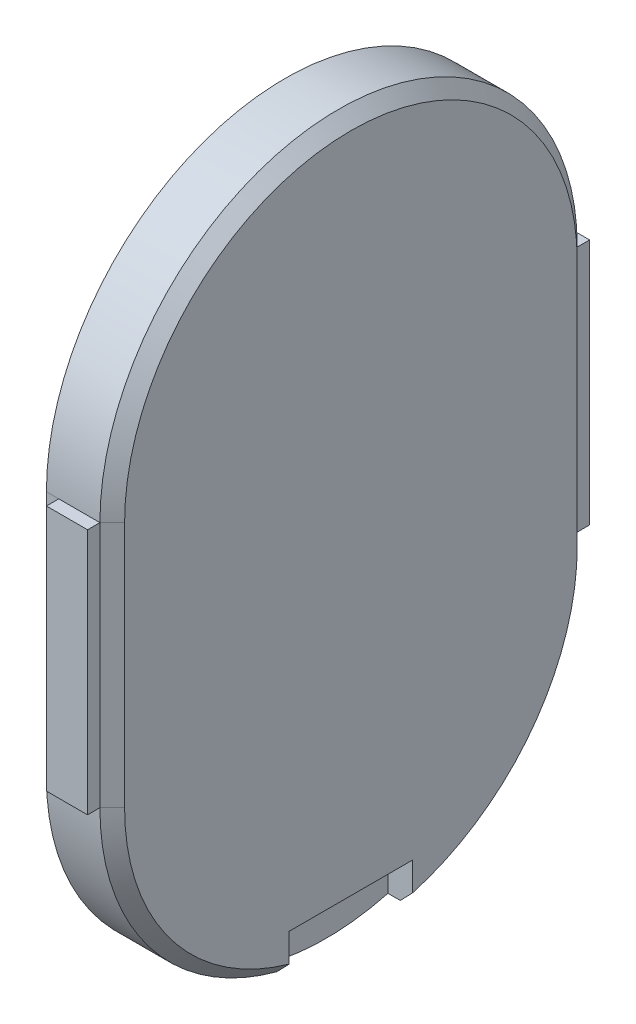
ISO-10303-21;
HEADER;
FILE_DESCRIPTION(('STEP AP214'),'2;1');
FILE_NAME('part.step','',(''),(''),'','','');
FILE_SCHEMA(('AUTOMOTIVE_DESIGN { 1 0 10303 214 1 1 1 1 }'));
ENDSEC;
DATA;
#1=APPLICATION_CONTEXT('core data for automotive mechanical design processes');
#2=APPLICATION_PROTOCOL_DEFINITION('international standard','automotive_design',2000,#1);
#3=PRODUCT_CONTEXT('',#1,'mechanical');
#4=PRODUCT('Part','Part','',(#3));
#5=PRODUCT_RELATED_PRODUCT_CATEGORY('part','',(#4));
#6=PRODUCT_DEFINITION_FORMATION('','',#4);
#7=PRODUCT_DEFINITION_CONTEXT('part definition',#1,'design');
#8=PRODUCT_DEFINITION('design','',#6,#7);
#9=PRODUCT_DEFINITION_SHAPE('','',#8);
#10=(LENGTH_UNIT() NAMED_UNIT(*) SI_UNIT(.MILLI.,.METRE.));
#11=(NAMED_UNIT(*) PLANE_ANGLE_UNIT() SI_UNIT($,.RADIAN.));
#12=(NAMED_UNIT(*) SI_UNIT($,.STERADIAN.) SOLID_ANGLE_UNIT());
#13=UNCERTAINTY_MEASURE_WITH_UNIT(LENGTH_MEASURE(1.E-05),#10,'distance_accuracy_value','');
#14=(GEOMETRIC_REPRESENTATION_CONTEXT(3) GLOBAL_UNCERTAINTY_ASSIGNED_CONTEXT((#13)) GLOBAL_UNIT_ASSIGNED_CONTEXT((#10,
#11,#12)) REPRESENTATION_CONTEXT('',''));
#15=CARTESIAN_POINT('',(0.,0.,0.));
#16=DIRECTION('',(0.,0.,1.));
#17=DIRECTION('',(1.,0.,0.));
#18=AXIS2_PLACEMENT_3D('',#15,#16,#17);
#19=CARTESIAN_POINT('',(63.,110.,67.4));
#20=DIRECTION('',(-1.,0.,0.));
#21=DIRECTION('',(0.,0.,1.));
#22=AXIS2_PLACEMENT_3D('',#19,#20,#21);
#23=CYLINDRICAL_SURFACE('',#22,5.8);
#24=DIRECTION('',(-1.,0.,0.));
#25=VECTOR('',#24,1.);
#26=CARTESIAN_POINT('',(63.,104.397322068867,68.9));
#27=LINE('',#26,#25);
#28=CARTESIAN_POINT('',(62.7,104.397322068867,68.9));
#29=VERTEX_POINT('',#28);
#30=CARTESIAN_POINT('',(62.4,104.397322068867,68.9));
#31=VERTEX_POINT('',#30);
#32=EDGE_CURVE('E193',#29,#31,#27,.T.);
#33=ORIENTED_EDGE('',*,*,#32,.F.);
#34=CARTESIAN_POINT('',(62.7,110.,67.4));
#35=DIRECTION('',(-1.,0.,0.));
#36=DIRECTION('',(0.,0.,1.));
#37=AXIS2_PLACEMENT_3D('',#34,#35,#36);
#38=CIRCLE('',#37,5.8);
#39=CARTESIAN_POINT('',(62.7,110.,73.2));
#40=VERTEX_POINT('',#39);
#41=EDGE_CURVE('E327',#29,#40,#38,.T.);
#42=ORIENTED_EDGE('',*,*,#41,.T.);
#43=DIRECTION('',(-1.,0.,0.));
#44=VECTOR('',#43,1.);
#45=CARTESIAN_POINT('',(63.,110.,73.2));
#46=LINE('',#45,#44);
#47=CARTESIAN_POINT('',(61.7,110.,73.2));
#48=VERTEX_POINT('',#47);
#49=EDGE_CURVE('E294',#40,#48,#46,.T.);
#50=ORIENTED_EDGE('',*,*,#49,.T.);
#51=CARTESIAN_POINT('',(61.4,110.,73.2));
#52=VERTEX_POINT('',#51);
#53=EDGE_CURVE('E293',#48,#52,#46,.T.);
#54=ORIENTED_EDGE('',*,*,#53,.T.);
#55=CARTESIAN_POINT('',(61.4,110.,67.4));
#56=DIRECTION('',(1.,0.,0.));
#57=DIRECTION('',(0.,0.,1.));
#58=AXIS2_PLACEMENT_3D('',#55,#56,#57);
#59=CIRCLE('',#58,5.8);
#60=CARTESIAN_POINT('',(61.4,110.,61.6));
#61=VERTEX_POINT('',#60);
#62=EDGE_CURVE('E289',#52,#61,#59,.T.);
#63=ORIENTED_EDGE('',*,*,#62,.T.);
#64=DIRECTION('',(-1.,0.,0.));
#65=VECTOR('',#64,1.);
#66=CARTESIAN_POINT('',(63.,110.,61.6));
#67=LINE('',#66,#65);
#68=CARTESIAN_POINT('',(61.7,110.,61.6));
#69=VERTEX_POINT('',#68);
#70=EDGE_CURVE('E308',#69,#61,#67,.T.);
#71=ORIENTED_EDGE('',*,*,#70,.F.);
#72=CARTESIAN_POINT('',(62.7,110.,61.6));
#73=VERTEX_POINT('',#72);
#74=EDGE_CURVE('E309',#73,#69,#67,.T.);
#75=ORIENTED_EDGE('',*,*,#74,.F.);
#76=CARTESIAN_POINT('',(62.7,104.397322068867,65.9));
#77=VERTEX_POINT('',#76);
#78=EDGE_CURVE('E328',#73,#77,#38,.T.);
#79=ORIENTED_EDGE('',*,*,#78,.T.);
#80=DIRECTION('',(-1.,0.,0.));
#81=VECTOR('',#80,1.);
#82=CARTESIAN_POINT('',(63.,104.397322068867,65.9));
#83=LINE('',#82,#81);
#84=CARTESIAN_POINT('',(62.4,104.397322068867,65.9));
#85=VERTEX_POINT('',#84);
#86=EDGE_CURVE('E66',#77,#85,#83,.T.);
#87=ORIENTED_EDGE('',*,*,#86,.T.);
#88=CARTESIAN_POINT('',(62.4,110.,67.4));
#89=DIRECTION('',(1.,0.,0.));
#90=DIRECTION('',(0.,0.,-1.));
#91=AXIS2_PLACEMENT_3D('',#88,#89,#90);
#92=CIRCLE('',#91,5.8);
#93=EDGE_CURVE('E11',#31,#85,#92,.T.);
#94=ORIENTED_EDGE('',*,*,#93,.F.);
#95=EDGE_LOOP('',(#33,#42,#50,#54,#63,#71,#75,#79,#87,#94));
#96=FACE_BOUND('',#95,.T.);
#97=ADVANCED_FACE('F49',(#96),#23,.T.);
#98=CARTESIAN_POINT('',(63.,110.,67.4));
#99=DIRECTION('',(-1.,0.,0.));
#100=DIRECTION('',(0.,0.,1.));
#101=AXIS2_PLACEMENT_3D('',#98,#99,#100);
#102=PLANE('',#101);
#103=DIRECTION('',(0.,-1.,0.));
#104=VECTOR('',#103,1.);
#105=CARTESIAN_POINT('',(63.,110.,68.9));
#106=LINE('',#105,#104);
#107=CARTESIAN_POINT('',(63.,105.4,68.9));
#108=VERTEX_POINT('',#107);
#109=CARTESIAN_POINT('',(63.,104.708497377871,68.9));
#110=VERTEX_POINT('',#109);
#111=EDGE_CURVE('E207',#108,#110,#106,.T.);
#112=ORIENTED_EDGE('',*,*,#111,.F.);
#113=DIRECTION('',(0.,0.,1.));
#114=VECTOR('',#113,1.);
#115=CARTESIAN_POINT('',(63.,105.4,67.4));
#116=LINE('',#115,#114);
#117=CARTESIAN_POINT('',(63.,105.4,65.9));
#118=VERTEX_POINT('',#117);
#119=EDGE_CURVE('E59',#118,#108,#116,.T.);
#120=ORIENTED_EDGE('',*,*,#119,.F.);
#121=DIRECTION('',(0.,-1.,0.));
#122=VECTOR('',#121,1.);
#123=CARTESIAN_POINT('',(63.,110.,65.9));
#124=LINE('',#123,#122);
#125=CARTESIAN_POINT('',(63.,104.708497377871,65.9));
#126=VERTEX_POINT('',#125);
#127=EDGE_CURVE('E189',#118,#126,#124,.T.);
#128=ORIENTED_EDGE('',*,*,#127,.T.);
#129=CARTESIAN_POINT('',(63.,110.,67.4));
#130=DIRECTION('',(-1.,0.,0.));
#131=DIRECTION('',(0.,0.,1.));
#132=AXIS2_PLACEMENT_3D('',#129,#130,#131);
#133=CIRCLE('',#132,5.50000000000002);
#134=CARTESIAN_POINT('',(63.,110.,61.9));
#135=VERTEX_POINT('',#134);
#136=EDGE_CURVE('E322',#126,#135,#133,.F.);
#137=ORIENTED_EDGE('',*,*,#136,.T.);
#138=DIRECTION('',(0.,1.,0.));
#139=VECTOR('',#138,1.);
#140=CARTESIAN_POINT('',(63.,110.,61.9));
#141=LINE('',#140,#139);
#142=CARTESIAN_POINT('',(63.,116.,61.9));
#143=VERTEX_POINT('',#142);
#144=EDGE_CURVE('E319',#135,#143,#141,.T.);
#145=ORIENTED_EDGE('',*,*,#144,.T.);
#146=CARTESIAN_POINT('',(63.,116.,67.4));
#147=DIRECTION('',(-1.,0.,0.));
#148=DIRECTION('',(0.,0.,1.));
#149=AXIS2_PLACEMENT_3D('',#146,#147,#148);
#150=CIRCLE('',#149,5.50000000000002);
#151=CARTESIAN_POINT('',(63.,116.,72.9));
#152=VERTEX_POINT('',#151);
#153=EDGE_CURVE('E313',#143,#152,#150,.F.);
#154=ORIENTED_EDGE('',*,*,#153,.T.);
#155=DIRECTION('',(0.,-1.,0.));
#156=VECTOR('',#155,1.);
#157=CARTESIAN_POINT('',(63.,110.,72.9));
#158=LINE('',#157,#156);
#159=CARTESIAN_POINT('',(63.,110.,72.9));
#160=VERTEX_POINT('',#159);
#161=EDGE_CURVE('E316',#152,#160,#158,.T.);
#162=ORIENTED_EDGE('',*,*,#161,.T.);
#163=EDGE_CURVE('E323',#160,#110,#133,.F.);
#164=ORIENTED_EDGE('',*,*,#163,.T.);
#165=EDGE_LOOP('',(#112,#120,#128,#137,#145,#154,#162,#164));
#166=FACE_BOUND('',#165,.T.);
#167=ADVANCED_FACE('F425',(#166),#102,.F.);
#168=CARTESIAN_POINT('',(63.,110.,67.4));
#169=DIRECTION('',(-1.,0.,0.));
#170=DIRECTION('',(0.,0.,1.));
#171=AXIS2_PLACEMENT_3D('',#168,#169,#170);
#172=CONICAL_SURFACE('',#171,5.50000000000002,0.785398163397448);
#173=ORIENTED_EDGE('',*,*,#41,.F.);
#174=CARTESIAN_POINT('',(61.4628683123147,103.124592929155,68.9));
#175=CARTESIAN_POINT('',(61.6959494424737,103.363197804304,68.9));
#176=CARTESIAN_POINT('',(61.9287883147822,103.602040927902,68.9));
#177=CARTESIAN_POINT('',(62.3936696597395,104.080488885385,68.9));
#178=CARTESIAN_POINT('',(62.6257121524155,104.320093699818,68.9));
#179=CARTESIAN_POINT('',(63.0887046335069,104.800366398064,68.9));
#180=CARTESIAN_POINT('',(63.3196546032696,105.041034299892,68.9));
#181=CARTESIAN_POINT('',(63.6648267390506,105.403236485253,68.9));
#182=CARTESIAN_POINT('',(63.7796767548245,105.524172135007,68.9));
#183=CARTESIAN_POINT('',(64.0088383775944,105.766553873108,68.9));
#184=CARTESIAN_POINT('',(64.1231499809188,105.887999964926,68.9));
#185=CARTESIAN_POINT('',(64.2371316876853,106.00975611671,68.9));
#186=B_SPLINE_CURVE_WITH_KNOTS('',3,(#174,#175,#176,#177,#178,#179,#180,#181,#182,#183,#184,
#185),.UNSPECIFIED.,.F.,.F.,(4,2,2,2,2,4),(0.,1.00066718336188,2.00130901489091,
3.00196786925571,3.50230991491599,4.00265536751886),.UNSPECIFIED.);
#187=EDGE_CURVE('E365',#29,#110,#186,.T.);
#188=ORIENTED_EDGE('',*,*,#187,.T.);
#189=ORIENTED_EDGE('',*,*,#163,.F.);
#190=DIRECTION('',(-0.707106781186548,0.,0.707106781186548));
#191=VECTOR('',#190,1.);
#192=CARTESIAN_POINT('',(63.,110.,72.9));
#193=LINE('',#192,#191);
#194=EDGE_CURVE('E347',#160,#40,#193,.T.);
#195=ORIENTED_EDGE('',*,*,#194,.T.);
#196=EDGE_LOOP('',(#173,#188,#189,#195));
#197=FACE_BOUND('',#196,.T.);
#198=ADVANCED_FACE('F428',(#197),#172,.T.);
#199=CARTESIAN_POINT('',(63.,110.,73.2));
#200=DIRECTION('',(0.,0.,-1.));
#201=DIRECTION('',(-1.,0.,0.));
#202=AXIS2_PLACEMENT_3D('',#199,#200,#201);
#203=PLANE('',#202);
#204=DIRECTION('',(0.,-1.,0.));
#205=VECTOR('',#204,1.);
#206=CARTESIAN_POINT('',(61.7,110.,73.2));
#207=LINE('',#206,#205);
#208=CARTESIAN_POINT('',(61.7,116.,73.2));
#209=VERTEX_POINT('',#208);
#210=EDGE_CURVE('E74',#209,#48,#207,.T.);
#211=ORIENTED_EDGE('',*,*,#210,.F.);
#212=DIRECTION('',(-1.,0.,0.));
#213=VECTOR('',#212,1.);
#214=CARTESIAN_POINT('',(63.,116.,73.2));
#215=LINE('',#214,#213);
#216=CARTESIAN_POINT('',(61.4,116.,73.2));
#217=VERTEX_POINT('',#216);
#218=EDGE_CURVE('E298',#209,#217,#215,.T.);
#219=ORIENTED_EDGE('',*,*,#218,.T.);
#220=DIRECTION('',(0.,-1.,0.));
#221=VECTOR('',#220,1.);
#222=CARTESIAN_POINT('',(61.4,110.,73.2));
#223=LINE('',#222,#221);
#224=EDGE_CURVE('E285',#217,#52,#223,.T.);
#225=ORIENTED_EDGE('',*,*,#224,.T.);
#226=ORIENTED_EDGE('',*,*,#53,.F.);
#227=EDGE_LOOP('',(#211,#219,#225,#226));
#228=FACE_BOUND('',#227,.T.);
#229=ADVANCED_FACE('F438',(#228),#203,.F.);
#230=CARTESIAN_POINT('',(63.,116.,61.6));
#231=DIRECTION('',(0.,0.,1.));
#232=DIRECTION('',(1.,0.,0.));
#233=AXIS2_PLACEMENT_3D('',#230,#231,#232);
#234=PLANE('',#233);
#235=DIRECTION('',(0.,1.,0.));
#236=VECTOR('',#235,1.);
#237=CARTESIAN_POINT('',(61.7,116.,61.6));
#238=LINE('',#237,#236);
#239=CARTESIAN_POINT('',(61.7,116.,61.6));
#240=VERTEX_POINT('',#239);
#241=EDGE_CURVE('E271',#69,#240,#238,.T.);
#242=ORIENTED_EDGE('',*,*,#241,.F.);
#243=ORIENTED_EDGE('',*,*,#70,.T.);
#244=DIRECTION('',(0.,1.,0.));
#245=VECTOR('',#244,1.);
#246=CARTESIAN_POINT('',(61.4,116.,61.6));
#247=LINE('',#246,#245);
#248=CARTESIAN_POINT('',(61.4,116.,61.6));
#249=VERTEX_POINT('',#248);
#250=EDGE_CURVE('E276',#61,#249,#247,.T.);
#251=ORIENTED_EDGE('',*,*,#250,.T.);
#252=DIRECTION('',(-1.,0.,0.));
#253=VECTOR('',#252,1.);
#254=CARTESIAN_POINT('',(63.,116.,61.6));
#255=LINE('',#254,#253);
#256=EDGE_CURVE('E303',#240,#249,#255,.T.);
#257=ORIENTED_EDGE('',*,*,#256,.F.);
#258=EDGE_LOOP('',(#242,#243,#251,#257));
#259=FACE_BOUND('',#258,.T.);
#260=ADVANCED_FACE('F441',(#259),#234,.F.);
#261=CARTESIAN_POINT('',(63.,116.,67.4));
#262=DIRECTION('',(-1.,0.,0.));
#263=DIRECTION('',(0.,0.,1.));
#264=AXIS2_PLACEMENT_3D('',#261,#262,#263);
#265=CYLINDRICAL_SURFACE('',#264,5.8);
#266=CARTESIAN_POINT('',(62.7,116.,73.2));
#267=VERTEX_POINT('',#266);
#268=EDGE_CURVE('E299',#267,#209,#215,.T.);
#269=ORIENTED_EDGE('',*,*,#268,.F.);
#270=CARTESIAN_POINT('',(62.7,116.,67.4));
#271=DIRECTION('',(-1.,0.,0.));
#272=DIRECTION('',(0.,0.,1.));
#273=AXIS2_PLACEMENT_3D('',#270,#271,#272);
#274=CIRCLE('',#273,5.8);
#275=CARTESIAN_POINT('',(62.7,116.,61.6));
#276=VERTEX_POINT('',#275);
#277=EDGE_CURVE('E340',#267,#276,#274,.T.);
#278=ORIENTED_EDGE('',*,*,#277,.T.);
#279=EDGE_CURVE('E304',#276,#240,#255,.T.);
#280=ORIENTED_EDGE('',*,*,#279,.T.);
#281=ORIENTED_EDGE('',*,*,#256,.T.);
#282=CARTESIAN_POINT('',(61.4,116.,67.4));
#283=DIRECTION('',(1.,0.,0.));
#284=DIRECTION('',(0.,0.,1.));
#285=AXIS2_PLACEMENT_3D('',#282,#283,#284);
#286=CIRCLE('',#285,5.8);
#287=EDGE_CURVE('E280',#249,#217,#286,.T.);
#288=ORIENTED_EDGE('',*,*,#287,.T.);
#289=ORIENTED_EDGE('',*,*,#218,.F.);
#290=EDGE_LOOP('',(#269,#278,#280,#281,#288,#289));
#291=FACE_BOUND('',#290,.T.);
#292=ADVANCED_FACE('F433',(#291),#265,.T.);
#293=CARTESIAN_POINT('',(61.4,110.,67.4));
#294=DIRECTION('',(-1.,0.,0.));
#295=DIRECTION('',(0.,0.,1.));
#296=AXIS2_PLACEMENT_3D('',#293,#294,#295);
#297=PLANE('',#296);
#298=ORIENTED_EDGE('',*,*,#250,.F.);
#299=ORIENTED_EDGE('',*,*,#62,.F.);
#300=ORIENTED_EDGE('',*,*,#224,.F.);
#301=ORIENTED_EDGE('',*,*,#287,.F.);
#302=EDGE_LOOP('',(#298,#299,#300,#301));
#303=FACE_BOUND('',#302,.T.);
#304=ADVANCED_FACE('F430',(#303),#297,.T.);
#305=CARTESIAN_POINT('',(63.,116.,67.4));
#306=DIRECTION('',(-1.,0.,0.));
#307=DIRECTION('',(0.,0.,1.));
#308=AXIS2_PLACEMENT_3D('',#305,#306,#307);
#309=CONICAL_SURFACE('',#308,5.50000000000002,0.785398163397448);
#310=DIRECTION('',(0.707106781186548,0.,0.707106781186548));
#311=VECTOR('',#310,1.);
#312=CARTESIAN_POINT('',(62.7,116.,61.6));
#313=LINE('',#312,#311);
#314=EDGE_CURVE('E351',#276,#143,#313,.T.);
#315=ORIENTED_EDGE('',*,*,#314,.F.);
#316=ORIENTED_EDGE('',*,*,#277,.F.);
#317=DIRECTION('',(-0.707106781186548,0.,0.707106781186548));
#318=VECTOR('',#317,1.);
#319=CARTESIAN_POINT('',(63.,116.,72.9));
#320=LINE('',#319,#318);
#321=EDGE_CURVE('E281',#152,#267,#320,.T.);
#322=ORIENTED_EDGE('',*,*,#321,.F.);
#323=ORIENTED_EDGE('',*,*,#153,.F.);
#324=EDGE_LOOP('',(#315,#316,#322,#323));
#325=FACE_BOUND('',#324,.T.);
#326=ADVANCED_FACE('F52',(#325),#309,.T.);
#327=CARTESIAN_POINT('',(63.,110.,72.9));
#328=DIRECTION('',(-0.707106781186548,0.,-0.707106781186548));
#329=DIRECTION('',(0.,-1.,0.));
#330=AXIS2_PLACEMENT_3D('',#327,#328,#329);
#331=PLANE('',#330);
#332=ORIENTED_EDGE('',*,*,#321,.T.);
#333=DIRECTION('',(0.,1.,0.));
#334=VECTOR('',#333,1.);
#335=CARTESIAN_POINT('',(62.7,110.,73.2));
#336=LINE('',#335,#334);
#337=EDGE_CURVE('E336',#40,#267,#336,.T.);
#338=ORIENTED_EDGE('',*,*,#337,.F.);
#339=ORIENTED_EDGE('',*,*,#194,.F.);
#340=ORIENTED_EDGE('',*,*,#161,.F.);
#341=EDGE_LOOP('',(#332,#338,#339,#340));
#342=FACE_BOUND('',#341,.T.);
#343=ADVANCED_FACE('F502',(#342),#331,.F.);
#344=CARTESIAN_POINT('',(63.,110.,61.9));
#345=DIRECTION('',(-0.707106781186548,0.,0.707106781186548));
#346=DIRECTION('',(0.,1.,0.));
#347=AXIS2_PLACEMENT_3D('',#344,#345,#346);
#348=PLANE('',#347);
#349=ORIENTED_EDGE('',*,*,#314,.T.);
#350=ORIENTED_EDGE('',*,*,#144,.F.);
#351=DIRECTION('',(0.707106781186548,0.,0.707106781186548));
#352=VECTOR('',#351,1.);
#353=CARTESIAN_POINT('',(62.7,110.,61.6));
#354=LINE('',#353,#352);
#355=EDGE_CURVE('E275',#73,#135,#354,.T.);
#356=ORIENTED_EDGE('',*,*,#355,.F.);
#357=DIRECTION('',(0.,-1.,0.));
#358=VECTOR('',#357,1.);
#359=CARTESIAN_POINT('',(62.7,116.,61.6));
#360=LINE('',#359,#358);
#361=EDGE_CURVE('E332',#276,#73,#360,.T.);
#362=ORIENTED_EDGE('',*,*,#361,.F.);
#363=EDGE_LOOP('',(#349,#350,#356,#362));
#364=FACE_BOUND('',#363,.T.);
#365=ADVANCED_FACE('F466',(#364),#348,.F.);
#366=CARTESIAN_POINT('',(61.4628683123147,103.124592929155,65.9));
#367=CARTESIAN_POINT('',(61.6959494424737,103.363197804304,65.9));
#368=CARTESIAN_POINT('',(61.9287883147822,103.602040927902,65.9));
#369=CARTESIAN_POINT('',(62.3936696597395,104.080488885385,65.9));
#370=CARTESIAN_POINT('',(62.6257121524155,104.320093699818,65.9));
#371=CARTESIAN_POINT('',(63.0887046335069,104.800366398064,65.9));
#372=CARTESIAN_POINT('',(63.3196546032696,105.041034299892,65.9));
#373=CARTESIAN_POINT('',(63.6648267390506,105.403236485253,65.9));
#374=CARTESIAN_POINT('',(63.7796767548245,105.524172135007,65.9));
#375=CARTESIAN_POINT('',(64.0088383775944,105.766553873108,65.9));
#376=CARTESIAN_POINT('',(64.1231499809188,105.887999964926,65.9));
#377=CARTESIAN_POINT('',(64.2371316876853,106.00975611671,65.9));
#378=B_SPLINE_CURVE_WITH_KNOTS('',3,(#366,#367,#368,#369,#370,#371,#372,#373,#374,#375,#376,
#377),.UNSPECIFIED.,.F.,.F.,(4,2,2,2,2,4),(0.,1.00066718336188,2.00130901489091,
3.00196786925571,3.50230991491599,4.00265536751886),.UNSPECIFIED.);
#379=EDGE_CURVE('E343',#77,#126,#378,.T.);
#380=ORIENTED_EDGE('',*,*,#379,.F.);
#381=ORIENTED_EDGE('',*,*,#78,.F.);
#382=ORIENTED_EDGE('',*,*,#355,.T.);
#383=ORIENTED_EDGE('',*,*,#136,.F.);
#384=EDGE_LOOP('',(#380,#381,#382,#383));
#385=FACE_BOUND('',#384,.T.);
#386=ADVANCED_FACE('F372',(#385),#172,.T.);
#387=CARTESIAN_POINT('',(61.7,116.,61.61));
#388=DIRECTION('',(0.,-1.,0.));
#389=DIRECTION('',(0.,0.,-1.));
#390=AXIS2_PLACEMENT_3D('',#387,#388,#389);
#391=PLANE('',#390);
#392=DIRECTION('',(0.,0.,-1.));
#393=VECTOR('',#392,1.);
#394=CARTESIAN_POINT('',(61.7,116.,61.61));
#395=LINE('',#394,#393);
#396=CARTESIAN_POINT('',(61.7,116.,61.3));
#397=VERTEX_POINT('',#396);
#398=EDGE_CURVE('E259',#240,#397,#395,.T.);
#399=ORIENTED_EDGE('',*,*,#398,.F.);
#400=ORIENTED_EDGE('',*,*,#279,.F.);
#401=DIRECTION('',(0.,0.,-1.));
#402=VECTOR('',#401,1.);
#403=CARTESIAN_POINT('',(62.7,116.,61.61));
#404=LINE('',#403,#402);
#405=CARTESIAN_POINT('',(62.7,116.,61.3));
#406=VERTEX_POINT('',#405);
#407=EDGE_CURVE('E262',#276,#406,#404,.T.);
#408=ORIENTED_EDGE('',*,*,#407,.T.);
#409=DIRECTION('',(-1.,0.,0.));
#410=VECTOR('',#409,1.);
#411=CARTESIAN_POINT('',(61.7,116.,61.3));
#412=LINE('',#411,#410);
#413=EDGE_CURVE('E255',#406,#397,#412,.T.);
#414=ORIENTED_EDGE('',*,*,#413,.T.);
#415=EDGE_LOOP('',(#399,#400,#408,#414));
#416=FACE_BOUND('',#415,.T.);
#417=ADVANCED_FACE('F410',(#416),#391,.F.);
#418=CARTESIAN_POINT('',(61.7,110.,61.61));
#419=DIRECTION('',(0.,1.,0.));
#420=DIRECTION('',(0.,0.,1.));
#421=AXIS2_PLACEMENT_3D('',#418,#419,#420);
#422=PLANE('',#421);
#423=DIRECTION('',(0.,0.,-1.));
#424=VECTOR('',#423,1.);
#425=CARTESIAN_POINT('',(62.7,110.,61.61));
#426=LINE('',#425,#424);
#427=CARTESIAN_POINT('',(62.7,110.,61.3));
#428=VERTEX_POINT('',#427);
#429=EDGE_CURVE('E265',#73,#428,#426,.T.);
#430=ORIENTED_EDGE('',*,*,#429,.F.);
#431=ORIENTED_EDGE('',*,*,#74,.T.);
#432=DIRECTION('',(0.,0.,-1.));
#433=VECTOR('',#432,1.);
#434=CARTESIAN_POINT('',(61.7,110.,61.61));
#435=LINE('',#434,#433);
#436=CARTESIAN_POINT('',(61.7,110.,61.3));
#437=VERTEX_POINT('',#436);
#438=EDGE_CURVE('E268',#69,#437,#435,.T.);
#439=ORIENTED_EDGE('',*,*,#438,.T.);
#440=DIRECTION('',(1.,0.,0.));
#441=VECTOR('',#440,1.);
#442=CARTESIAN_POINT('',(61.7,110.,61.3));
#443=LINE('',#442,#441);
#444=EDGE_CURVE('E247',#437,#428,#443,.T.);
#445=ORIENTED_EDGE('',*,*,#444,.T.);
#446=EDGE_LOOP('',(#430,#431,#439,#445));
#447=FACE_BOUND('',#446,.T.);
#448=ADVANCED_FACE('F413',(#447),#422,.F.);
#449=CARTESIAN_POINT('',(61.7,110.,61.61));
#450=DIRECTION('',(1.,0.,0.));
#451=DIRECTION('',(0.,0.,-1.));
#452=AXIS2_PLACEMENT_3D('',#449,#450,#451);
#453=PLANE('',#452);
#454=ORIENTED_EDGE('',*,*,#438,.F.);
#455=ORIENTED_EDGE('',*,*,#241,.T.);
#456=ORIENTED_EDGE('',*,*,#398,.T.);
#457=DIRECTION('',(0.,-1.,0.));
#458=VECTOR('',#457,1.);
#459=CARTESIAN_POINT('',(61.7,110.,61.3));
#460=LINE('',#459,#458);
#461=EDGE_CURVE('E243',#397,#437,#460,.T.);
#462=ORIENTED_EDGE('',*,*,#461,.T.);
#463=EDGE_LOOP('',(#454,#455,#456,#462));
#464=FACE_BOUND('',#463,.T.);
#465=ADVANCED_FACE('F417',(#464),#453,.F.);
#466=CARTESIAN_POINT('',(62.7,110.,61.61));
#467=DIRECTION('',(-1.,0.,0.));
#468=DIRECTION('',(0.,0.,1.));
#469=AXIS2_PLACEMENT_3D('',#466,#467,#468);
#470=PLANE('',#469);
#471=ORIENTED_EDGE('',*,*,#361,.T.);
#472=ORIENTED_EDGE('',*,*,#429,.T.);
#473=DIRECTION('',(0.,1.,0.));
#474=VECTOR('',#473,1.);
#475=CARTESIAN_POINT('',(62.7,110.,61.3));
#476=LINE('',#475,#474);
#477=EDGE_CURVE('E251',#428,#406,#476,.T.);
#478=ORIENTED_EDGE('',*,*,#477,.T.);
#479=ORIENTED_EDGE('',*,*,#407,.F.);
#480=EDGE_LOOP('',(#471,#472,#478,#479));
#481=FACE_BOUND('',#480,.T.);
#482=ADVANCED_FACE('F408',(#481),#470,.F.);
#483=CARTESIAN_POINT('',(0.,0.,61.3));
#484=DIRECTION('',(0.,0.,-1.));
#485=DIRECTION('',(-1.,0.,0.));
#486=AXIS2_PLACEMENT_3D('',#483,#484,#485);
#487=PLANE('',#486);
#488=ORIENTED_EDGE('',*,*,#461,.F.);
#489=ORIENTED_EDGE('',*,*,#413,.F.);
#490=ORIENTED_EDGE('',*,*,#477,.F.);
#491=ORIENTED_EDGE('',*,*,#444,.F.);
#492=EDGE_LOOP('',(#488,#489,#490,#491));
#493=FACE_BOUND('',#492,.T.);
#494=ADVANCED_FACE('F394',(#493),#487,.T.);
#495=CARTESIAN_POINT('',(61.7,116.,73.5));
#496=DIRECTION('',(0.,-1.,0.));
#497=DIRECTION('',(0.,0.,-1.));
#498=AXIS2_PLACEMENT_3D('',#495,#496,#497);
#499=PLANE('',#498);
#500=DIRECTION('',(0.,0.,-1.));
#501=VECTOR('',#500,1.);
#502=CARTESIAN_POINT('',(62.7,116.,73.5));
#503=LINE('',#502,#501);
#504=CARTESIAN_POINT('',(62.7,116.,73.5));
#505=VERTEX_POINT('',#504);
#506=EDGE_CURVE('E229',#505,#267,#503,.T.);
#507=ORIENTED_EDGE('',*,*,#506,.T.);
#508=ORIENTED_EDGE('',*,*,#268,.T.);
#509=DIRECTION('',(0.,0.,-1.));
#510=VECTOR('',#509,1.);
#511=CARTESIAN_POINT('',(61.7,116.,73.5));
#512=LINE('',#511,#510);
#513=CARTESIAN_POINT('',(61.7,116.,73.5));
#514=VERTEX_POINT('',#513);
#515=EDGE_CURVE('E225',#514,#209,#512,.T.);
#516=ORIENTED_EDGE('',*,*,#515,.F.);
#517=DIRECTION('',(-1.,0.,0.));
#518=VECTOR('',#517,1.);
#519=CARTESIAN_POINT('',(61.7,116.,73.5));
#520=LINE('',#519,#518);
#521=EDGE_CURVE('E222',#505,#514,#520,.T.);
#522=ORIENTED_EDGE('',*,*,#521,.F.);
#523=EDGE_LOOP('',(#507,#508,#516,#522));
#524=FACE_BOUND('',#523,.T.);
#525=ADVANCED_FACE('F390',(#524),#499,.F.);
#526=CARTESIAN_POINT('',(61.7,110.,73.5));
#527=DIRECTION('',(0.,1.,0.));
#528=DIRECTION('',(0.,0.,1.));
#529=AXIS2_PLACEMENT_3D('',#526,#527,#528);
#530=PLANE('',#529);
#531=DIRECTION('',(0.,0.,-1.));
#532=VECTOR('',#531,1.);
#533=CARTESIAN_POINT('',(61.7,110.,73.5));
#534=LINE('',#533,#532);
#535=CARTESIAN_POINT('',(61.7,110.,73.5));
#536=VERTEX_POINT('',#535);
#537=EDGE_CURVE('E237',#536,#48,#534,.T.);
#538=ORIENTED_EDGE('',*,*,#537,.T.);
#539=ORIENTED_EDGE('',*,*,#49,.F.);
#540=DIRECTION('',(0.,0.,-1.));
#541=VECTOR('',#540,1.);
#542=CARTESIAN_POINT('',(62.7,110.,73.5));
#543=LINE('',#542,#541);
#544=CARTESIAN_POINT('',(62.7,110.,73.5));
#545=VERTEX_POINT('',#544);
#546=EDGE_CURVE('E233',#545,#40,#543,.T.);
#547=ORIENTED_EDGE('',*,*,#546,.F.);
#548=DIRECTION('',(1.,0.,0.));
#549=VECTOR('',#548,1.);
#550=CARTESIAN_POINT('',(61.7,110.,73.5));
#551=LINE('',#550,#549);
#552=EDGE_CURVE('E216',#536,#545,#551,.T.);
#553=ORIENTED_EDGE('',*,*,#552,.F.);
#554=EDGE_LOOP('',(#538,#539,#547,#553));
#555=FACE_BOUND('',#554,.T.);
#556=ADVANCED_FACE('F393',(#555),#530,.F.);
#557=CARTESIAN_POINT('',(61.7,110.,73.5));
#558=DIRECTION('',(1.,0.,0.));
#559=DIRECTION('',(0.,0.,-1.));
#560=AXIS2_PLACEMENT_3D('',#557,#558,#559);
#561=PLANE('',#560);
#562=ORIENTED_EDGE('',*,*,#515,.T.);
#563=ORIENTED_EDGE('',*,*,#210,.T.);
#564=ORIENTED_EDGE('',*,*,#537,.F.);
#565=DIRECTION('',(0.,-1.,0.));
#566=VECTOR('',#565,1.);
#567=CARTESIAN_POINT('',(61.7,110.,73.5));
#568=LINE('',#567,#566);
#569=EDGE_CURVE('E212',#514,#536,#568,.T.);
#570=ORIENTED_EDGE('',*,*,#569,.F.);
#571=EDGE_LOOP('',(#562,#563,#564,#570));
#572=FACE_BOUND('',#571,.T.);
#573=ADVANCED_FACE('F398',(#572),#561,.F.);
#574=CARTESIAN_POINT('',(62.7,110.,73.5));
#575=DIRECTION('',(-1.,0.,0.));
#576=DIRECTION('',(0.,0.,1.));
#577=AXIS2_PLACEMENT_3D('',#574,#575,#576);
#578=PLANE('',#577);
#579=ORIENTED_EDGE('',*,*,#337,.T.);
#580=ORIENTED_EDGE('',*,*,#506,.F.);
#581=DIRECTION('',(0.,1.,0.));
#582=VECTOR('',#581,1.);
#583=CARTESIAN_POINT('',(62.7,110.,73.5));
#584=LINE('',#583,#582);
#585=EDGE_CURVE('E219',#545,#505,#584,.T.);
#586=ORIENTED_EDGE('',*,*,#585,.F.);
#587=ORIENTED_EDGE('',*,*,#546,.T.);
#588=EDGE_LOOP('',(#579,#580,#586,#587));
#589=FACE_BOUND('',#588,.T.);
#590=ADVANCED_FACE('F388',(#589),#578,.F.);
#591=CARTESIAN_POINT('',(0.,0.,73.5));
#592=DIRECTION('',(0.,0.,-1.));
#593=DIRECTION('',(-1.,0.,0.));
#594=AXIS2_PLACEMENT_3D('',#591,#592,#593);
#595=PLANE('',#594);
#596=ORIENTED_EDGE('',*,*,#569,.T.);
#597=ORIENTED_EDGE('',*,*,#552,.T.);
#598=ORIENTED_EDGE('',*,*,#585,.T.);
#599=ORIENTED_EDGE('',*,*,#521,.T.);
#600=EDGE_LOOP('',(#596,#597,#598,#599));
#601=FACE_BOUND('',#600,.T.);
#602=ADVANCED_FACE('F385',(#601),#595,.F.);
#603=CARTESIAN_POINT('',(62.4,104.1,68.9));
#604=DIRECTION('',(1.,0.,0.));
#605=DIRECTION('',(0.,0.,-1.));
#606=AXIS2_PLACEMENT_3D('',#603,#604,#605);
#607=PLANE('',#606);
#608=ORIENTED_EDGE('',*,*,#93,.T.);
#609=DIRECTION('',(0.,-1.,0.));
#610=VECTOR('',#609,1.);
#611=CARTESIAN_POINT('',(62.4,104.1,65.9));
#612=LINE('',#611,#610);
#613=CARTESIAN_POINT('',(62.4,105.4,65.9));
#614=VERTEX_POINT('',#613);
#615=EDGE_CURVE('E187',#614,#85,#612,.T.);
#616=ORIENTED_EDGE('',*,*,#615,.F.);
#617=DIRECTION('',(0.,0.,-1.));
#618=VECTOR('',#617,1.);
#619=CARTESIAN_POINT('',(62.4,105.4,68.9));
#620=LINE('',#619,#618);
#621=CARTESIAN_POINT('',(62.4,105.4,68.9));
#622=VERTEX_POINT('',#621);
#623=EDGE_CURVE('E174',#622,#614,#620,.T.);
#624=ORIENTED_EDGE('',*,*,#623,.F.);
#625=DIRECTION('',(0.,-1.,0.));
#626=VECTOR('',#625,1.);
#627=CARTESIAN_POINT('',(62.4,104.1,68.9));
#628=LINE('',#627,#626);
#629=EDGE_CURVE('E181',#622,#31,#628,.T.);
#630=ORIENTED_EDGE('',*,*,#629,.T.);
#631=EDGE_LOOP('',(#608,#616,#624,#630));
#632=FACE_BOUND('',#631,.T.);
#633=ADVANCED_FACE('F185',(#632),#607,.T.);
#634=CARTESIAN_POINT('',(62.4,105.4,68.9));
#635=DIRECTION('',(0.,-1.,0.));
#636=DIRECTION('',(0.,0.,-1.));
#637=AXIS2_PLACEMENT_3D('',#634,#635,#636);
#638=PLANE('',#637);
#639=ORIENTED_EDGE('',*,*,#119,.T.);
#640=DIRECTION('',(-1.,0.,0.));
#641=VECTOR('',#640,1.);
#642=CARTESIAN_POINT('',(62.4,105.4,68.9));
#643=LINE('',#642,#641);
#644=EDGE_CURVE('E170',#108,#622,#643,.T.);
#645=ORIENTED_EDGE('',*,*,#644,.T.);
#646=ORIENTED_EDGE('',*,*,#623,.T.);
#647=DIRECTION('',(-1.,0.,0.));
#648=VECTOR('',#647,1.);
#649=CARTESIAN_POINT('',(62.4,105.4,65.9));
#650=LINE('',#649,#648);
#651=EDGE_CURVE('E195',#118,#614,#650,.T.);
#652=ORIENTED_EDGE('',*,*,#651,.F.);
#653=EDGE_LOOP('',(#639,#645,#646,#652));
#654=FACE_BOUND('',#653,.T.);
#655=ADVANCED_FACE('F172',(#654),#638,.T.);
#656=CARTESIAN_POINT('',(0.,0.,68.9));
#657=DIRECTION('',(0.,0.,-1.));
#658=DIRECTION('',(-1.,0.,0.));
#659=AXIS2_PLACEMENT_3D('',#656,#657,#658);
#660=PLANE('',#659);
#661=ORIENTED_EDGE('',*,*,#32,.T.);
#662=ORIENTED_EDGE('',*,*,#629,.F.);
#663=ORIENTED_EDGE('',*,*,#644,.F.);
#664=ORIENTED_EDGE('',*,*,#111,.T.);
#665=ORIENTED_EDGE('',*,*,#187,.F.);
#666=EDGE_LOOP('',(#661,#662,#663,#664,#665));
#667=FACE_BOUND('',#666,.T.);
#668=ADVANCED_FACE('F191',(#667),#660,.T.);
#669=CARTESIAN_POINT('',(0.,0.,65.9));
#670=DIRECTION('',(0.,0.,-1.));
#671=DIRECTION('',(-1.,0.,0.));
#672=AXIS2_PLACEMENT_3D('',#669,#670,#671);
#673=PLANE('',#672);
#674=ORIENTED_EDGE('',*,*,#379,.T.);
#675=ORIENTED_EDGE('',*,*,#127,.F.);
#676=ORIENTED_EDGE('',*,*,#651,.T.);
#677=ORIENTED_EDGE('',*,*,#615,.T.);
#678=ORIENTED_EDGE('',*,*,#86,.F.);
#679=EDGE_LOOP('',(#674,#675,#676,#677,#678));
#680=FACE_BOUND('',#679,.T.);
#681=ADVANCED_FACE('F376',(#680),#673,.F.);
#682=CLOSED_SHELL('',(#97,#167,#198,#229,#260,#292,#304,#326,#343,#365,#386,#417,#448,#465,#482,
#494,#525,#556,#573,#590,#602,#633,#655,#668,#681));
#683=MANIFOLD_SOLID_BREP('B2',#682);
#684=ADVANCED_BREP_SHAPE_REPRESENTATION('',(#18,#683),#14);
#685=SHAPE_DEFINITION_REPRESENTATION(#9,#684);
ENDSEC;
END-ISO-10303-21;
